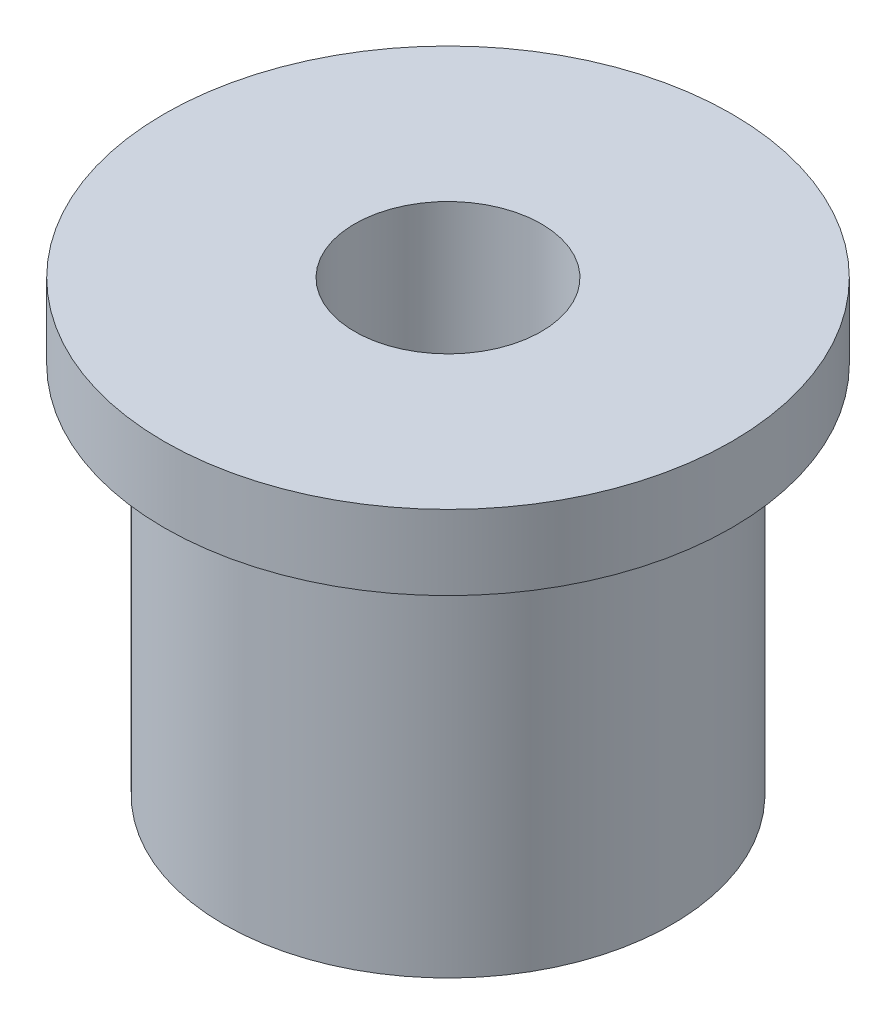
ISO-10303-21;
HEADER;
FILE_DESCRIPTION(('STEP AP214'),'2;1');
FILE_NAME('part.step','',(''),(''),'','','');
FILE_SCHEMA(('AUTOMOTIVE_DESIGN { 1 0 10303 214 1 1 1 1 }'));
ENDSEC;
DATA;
#1=APPLICATION_CONTEXT('core data for automotive mechanical design processes');
#2=APPLICATION_PROTOCOL_DEFINITION('international standard','automotive_design',2000,#1);
#3=PRODUCT_CONTEXT('',#1,'mechanical');
#4=PRODUCT('Part','Part','',(#3));
#5=PRODUCT_RELATED_PRODUCT_CATEGORY('part','',(#4));
#6=PRODUCT_DEFINITION_FORMATION('','',#4);
#7=PRODUCT_DEFINITION_CONTEXT('part definition',#1,'design');
#8=PRODUCT_DEFINITION('design','',#6,#7);
#9=PRODUCT_DEFINITION_SHAPE('','',#8);
#10=(LENGTH_UNIT() NAMED_UNIT(*) SI_UNIT(.MILLI.,.METRE.));
#11=(NAMED_UNIT(*) PLANE_ANGLE_UNIT() SI_UNIT($,.RADIAN.));
#12=(NAMED_UNIT(*) SI_UNIT($,.STERADIAN.) SOLID_ANGLE_UNIT());
#13=UNCERTAINTY_MEASURE_WITH_UNIT(LENGTH_MEASURE(1.E-05),#10,'distance_accuracy_value','');
#14=(GEOMETRIC_REPRESENTATION_CONTEXT(3) GLOBAL_UNCERTAINTY_ASSIGNED_CONTEXT((#13)) GLOBAL_UNIT_ASSIGNED_CONTEXT((#10,
#11,#12)) REPRESENTATION_CONTEXT('',''));
#15=CARTESIAN_POINT('',(0.,0.,0.));
#16=DIRECTION('',(0.,0.,1.));
#17=DIRECTION('',(1.,0.,0.));
#18=AXIS2_PLACEMENT_3D('',#15,#16,#17);
#19=CARTESIAN_POINT('',(0.,0.,-3.));
#20=DIRECTION('',(0.,-1.,0.));
#21=DIRECTION('',(0.,0.,-1.));
#22=AXIS2_PLACEMENT_3D('',#19,#20,#21);
#23=PLANE('',#22);
#24=CARTESIAN_POINT('',(0.,0.,0.));
#25=DIRECTION('',(0.,-1.,0.));
#26=DIRECTION('',(0.,0.,-1.));
#27=AXIS2_PLACEMENT_3D('',#24,#25,#26);
#28=CIRCLE('',#27,3.);
#29=CARTESIAN_POINT('',(0.,0.,-3.));
#30=VERTEX_POINT('',#29);
#31=EDGE_CURVE('E53',#30,#30,#28,.T.);
#32=ORIENTED_EDGE('',*,*,#31,.T.);
#33=EDGE_LOOP('',(#32));
#34=FACE_BOUND('',#33,.T.);
#35=CARTESIAN_POINT('',(0.,0.,0.));
#36=DIRECTION('',(0.,-1.,0.));
#37=DIRECTION('',(0.,0.,-1.));
#38=AXIS2_PLACEMENT_3D('',#35,#36,#37);
#39=CIRCLE('',#38,1.25);
#40=CARTESIAN_POINT('',(0.,0.,-1.25));
#41=VERTEX_POINT('',#40);
#42=EDGE_CURVE('E10',#41,#41,#39,.T.);
#43=ORIENTED_EDGE('',*,*,#42,.F.);
#44=EDGE_LOOP('',(#43));
#45=FACE_BOUND('',#44,.T.);
#46=ADVANCED_FACE('F31',(#34,#45),#23,.T.);
#47=CARTESIAN_POINT('',(0.,0.,0.));
#48=DIRECTION('',(0.,-1.,0.));
#49=DIRECTION('',(0.,0.,-1.));
#50=AXIS2_PLACEMENT_3D('',#47,#48,#49);
#51=CYLINDRICAL_SURFACE('',#50,1.25);
#52=ORIENTED_EDGE('',*,*,#42,.T.);
#53=EDGE_LOOP('',(#52));
#54=FACE_BOUND('',#53,.T.);
#55=CARTESIAN_POINT('',(0.,6.,0.));
#56=DIRECTION('',(0.,-1.,0.));
#57=DIRECTION('',(0.,0.,-1.));
#58=AXIS2_PLACEMENT_3D('',#55,#56,#57);
#59=CIRCLE('',#58,1.25);
#60=CARTESIAN_POINT('',(0.,6.,-1.25));
#61=VERTEX_POINT('',#60);
#62=EDGE_CURVE('E37',#61,#61,#59,.T.);
#63=ORIENTED_EDGE('',*,*,#62,.F.);
#64=EDGE_LOOP('',(#63));
#65=FACE_BOUND('',#64,.T.);
#66=ADVANCED_FACE('F71',(#54,#65),#51,.F.);
#67=CARTESIAN_POINT('',(0.,6.,-1.25));
#68=DIRECTION('',(0.,1.,0.));
#69=DIRECTION('',(0.,0.,1.));
#70=AXIS2_PLACEMENT_3D('',#67,#68,#69);
#71=PLANE('',#70);
#72=ORIENTED_EDGE('',*,*,#62,.T.);
#73=EDGE_LOOP('',(#72));
#74=FACE_BOUND('',#73,.T.);
#75=CARTESIAN_POINT('',(0.,6.,0.));
#76=DIRECTION('',(0.,-1.,0.));
#77=DIRECTION('',(0.,0.,-1.));
#78=AXIS2_PLACEMENT_3D('',#75,#76,#77);
#79=CIRCLE('',#78,3.8);
#80=CARTESIAN_POINT('',(0.,6.,-3.8));
#81=VERTEX_POINT('',#80);
#82=EDGE_CURVE('E41',#81,#81,#79,.T.);
#83=ORIENTED_EDGE('',*,*,#82,.F.);
#84=EDGE_LOOP('',(#83));
#85=FACE_BOUND('',#84,.T.);
#86=ADVANCED_FACE('F75',(#74,#85),#71,.T.);
#87=CARTESIAN_POINT('',(0.,0.,0.));
#88=DIRECTION('',(0.,-1.,0.));
#89=DIRECTION('',(0.,0.,-1.));
#90=AXIS2_PLACEMENT_3D('',#87,#88,#89);
#91=CYLINDRICAL_SURFACE('',#90,3.8);
#92=ORIENTED_EDGE('',*,*,#82,.T.);
#93=EDGE_LOOP('',(#92));
#94=FACE_BOUND('',#93,.T.);
#95=CARTESIAN_POINT('',(0.,5.,0.));
#96=DIRECTION('',(0.,-1.,0.));
#97=DIRECTION('',(0.,0.,-1.));
#98=AXIS2_PLACEMENT_3D('',#95,#96,#97);
#99=CIRCLE('',#98,3.8);
#100=CARTESIAN_POINT('',(0.,5.,-3.8));
#101=VERTEX_POINT('',#100);
#102=EDGE_CURVE('E45',#101,#101,#99,.T.);
#103=ORIENTED_EDGE('',*,*,#102,.F.);
#104=EDGE_LOOP('',(#103));
#105=FACE_BOUND('',#104,.T.);
#106=ADVANCED_FACE('F67',(#94,#105),#91,.T.);
#107=CARTESIAN_POINT('',(0.,5.,-3.8));
#108=DIRECTION('',(0.,-1.,0.));
#109=DIRECTION('',(0.,0.,-1.));
#110=AXIS2_PLACEMENT_3D('',#107,#108,#109);
#111=PLANE('',#110);
#112=ORIENTED_EDGE('',*,*,#102,.T.);
#113=EDGE_LOOP('',(#112));
#114=FACE_BOUND('',#113,.T.);
#115=CARTESIAN_POINT('',(0.,5.,0.));
#116=DIRECTION('',(0.,-1.,0.));
#117=DIRECTION('',(0.,0.,-1.));
#118=AXIS2_PLACEMENT_3D('',#115,#116,#117);
#119=CIRCLE('',#118,3.);
#120=CARTESIAN_POINT('',(0.,5.,-3.));
#121=VERTEX_POINT('',#120);
#122=EDGE_CURVE('E50',#121,#121,#119,.T.);
#123=ORIENTED_EDGE('',*,*,#122,.F.);
#124=EDGE_LOOP('',(#123));
#125=FACE_BOUND('',#124,.T.);
#126=ADVANCED_FACE('F61',(#114,#125),#111,.T.);
#127=CARTESIAN_POINT('',(0.,0.,0.));
#128=DIRECTION('',(0.,-1.,0.));
#129=DIRECTION('',(0.,0.,-1.));
#130=AXIS2_PLACEMENT_3D('',#127,#128,#129);
#131=CYLINDRICAL_SURFACE('',#130,3.);
#132=ORIENTED_EDGE('',*,*,#122,.T.);
#133=EDGE_LOOP('',(#132));
#134=FACE_BOUND('',#133,.T.);
#135=ORIENTED_EDGE('',*,*,#31,.F.);
#136=EDGE_LOOP('',(#135));
#137=FACE_BOUND('',#136,.T.);
#138=ADVANCED_FACE('F59',(#134,#137),#131,.T.);
#139=CLOSED_SHELL('',(#46,#66,#86,#106,#126,#138));
#140=MANIFOLD_SOLID_BREP('B2',#139);
#141=ADVANCED_BREP_SHAPE_REPRESENTATION('',(#18,#140),#14);
#142=SHAPE_DEFINITION_REPRESENTATION(#9,#141);
ENDSEC;
END-ISO-10303-21;
